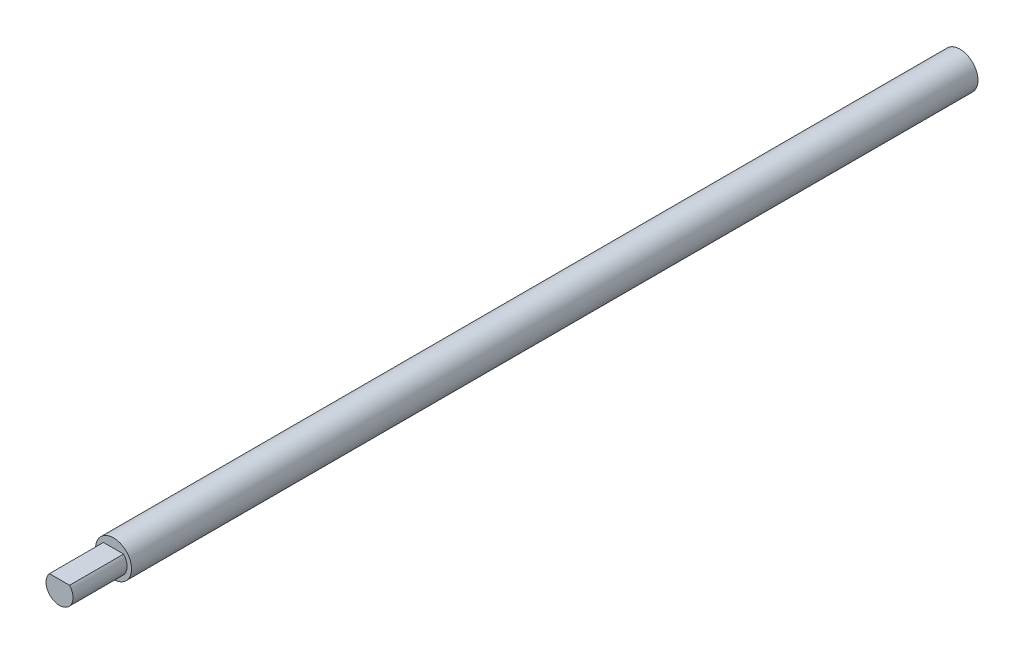
ISO-10303-21;
HEADER;
FILE_DESCRIPTION(('STEP AP214'),'2;1');
FILE_NAME('part.step','',(''),(''),'','','');
FILE_SCHEMA(('AUTOMOTIVE_DESIGN { 1 0 10303 214 1 1 1 1 }'));
ENDSEC;
DATA;
#1=APPLICATION_CONTEXT('core data for automotive mechanical design processes');
#2=APPLICATION_PROTOCOL_DEFINITION('international standard','automotive_design',2000,#1);
#3=PRODUCT_CONTEXT('',#1,'mechanical');
#4=PRODUCT('Part','Part','',(#3));
#5=PRODUCT_RELATED_PRODUCT_CATEGORY('part','',(#4));
#6=PRODUCT_DEFINITION_FORMATION('','',#4);
#7=PRODUCT_DEFINITION_CONTEXT('part definition',#1,'design');
#8=PRODUCT_DEFINITION('design','',#6,#7);
#9=PRODUCT_DEFINITION_SHAPE('','',#8);
#10=(LENGTH_UNIT() NAMED_UNIT(*) SI_UNIT(.MILLI.,.METRE.));
#11=(NAMED_UNIT(*) PLANE_ANGLE_UNIT() SI_UNIT($,.RADIAN.));
#12=(NAMED_UNIT(*) SI_UNIT($,.STERADIAN.) SOLID_ANGLE_UNIT());
#13=UNCERTAINTY_MEASURE_WITH_UNIT(LENGTH_MEASURE(1.E-05),#10,'distance_accuracy_value','');
#14=(GEOMETRIC_REPRESENTATION_CONTEXT(3) GLOBAL_UNCERTAINTY_ASSIGNED_CONTEXT((#13)) GLOBAL_UNIT_ASSIGNED_CONTEXT((#10,
#11,#12)) REPRESENTATION_CONTEXT('',''));
#15=CARTESIAN_POINT('',(0.,0.,0.));
#16=DIRECTION('',(0.,0.,1.));
#17=DIRECTION('',(1.,0.,0.));
#18=AXIS2_PLACEMENT_3D('',#15,#16,#17);
#19=CARTESIAN_POINT('',(0.,0.,0.));
#20=DIRECTION('',(0.,0.,1.));
#21=DIRECTION('',(1.,0.,0.));
#22=AXIS2_PLACEMENT_3D('',#19,#20,#21);
#23=PLANE('',#22);
#24=CARTESIAN_POINT('',(0.,0.,0.));
#25=DIRECTION('',(0.,0.,1.));
#26=DIRECTION('',(1.,0.,0.));
#27=AXIS2_PLACEMENT_3D('',#24,#25,#26);
#28=CIRCLE('',#27,4.);
#29=CARTESIAN_POINT('',(4.,0.,0.));
#30=VERTEX_POINT('',#29);
#31=EDGE_CURVE('E69',#30,#30,#28,.T.);
#32=ORIENTED_EDGE('',*,*,#31,.F.);
#33=EDGE_LOOP('',(#32));
#34=FACE_BOUND('',#33,.T.);
#35=ADVANCED_FACE('F34',(#34),#23,.F.);
#36=CARTESIAN_POINT('',(0.,0.,0.));
#37=DIRECTION('',(0.,0.,1.));
#38=DIRECTION('',(1.,0.,0.));
#39=AXIS2_PLACEMENT_3D('',#36,#37,#38);
#40=CYLINDRICAL_SURFACE('',#39,4.);
#41=CARTESIAN_POINT('',(0.,0.,188.));
#42=DIRECTION('',(0.,0.,-1.));
#43=DIRECTION('',(-1.,0.,0.));
#44=AXIS2_PLACEMENT_3D('',#41,#42,#43);
#45=CIRCLE('',#44,4.);
#46=CARTESIAN_POINT('',(-4.,0.,188.));
#47=VERTEX_POINT('',#46);
#48=EDGE_CURVE('E77',#47,#47,#45,.F.);
#49=ORIENTED_EDGE('',*,*,#48,.F.);
#50=EDGE_LOOP('',(#49));
#51=FACE_BOUND('',#50,.T.);
#52=ORIENTED_EDGE('',*,*,#31,.T.);
#53=EDGE_LOOP('',(#52));
#54=FACE_BOUND('',#53,.T.);
#55=ADVANCED_FACE('F81',(#51,#54),#40,.T.);
#56=CARTESIAN_POINT('',(0.,0.,200.));
#57=DIRECTION('',(0.,0.,1.));
#58=DIRECTION('',(1.,0.,0.));
#59=AXIS2_PLACEMENT_3D('',#56,#57,#58);
#60=PLANE('',#59);
#61=CARTESIAN_POINT('',(0.,0.,200.));
#62=DIRECTION('',(0.,0.,-1.));
#63=DIRECTION('',(-1.,0.,0.));
#64=AXIS2_PLACEMENT_3D('',#61,#62,#63);
#65=CIRCLE('',#64,2.99999999999997);
#66=CARTESIAN_POINT('',(2.23606797749975,2.,200.));
#67=VERTEX_POINT('',#66);
#68=CARTESIAN_POINT('',(-2.23606797749975,2.,200.));
#69=VERTEX_POINT('',#68);
#70=EDGE_CURVE('E57',#67,#69,#65,.T.);
#71=ORIENTED_EDGE('',*,*,#70,.F.);
#72=DIRECTION('',(1.,0.,0.));
#73=VECTOR('',#72,1.);
#74=CARTESIAN_POINT('',(0.,2.,200.));
#75=LINE('',#74,#73);
#76=EDGE_CURVE('E72',#69,#67,#75,.T.);
#77=ORIENTED_EDGE('',*,*,#76,.F.);
#78=EDGE_LOOP('',(#71,#77));
#79=FACE_BOUND('',#78,.T.);
#80=ADVANCED_FACE('F84',(#79),#60,.T.);
#81=CARTESIAN_POINT('',(-4.,2.,188.));
#82=DIRECTION('',(0.,0.,-1.));
#83=DIRECTION('',(-1.,0.,0.));
#84=AXIS2_PLACEMENT_3D('',#81,#82,#83);
#85=PLANE('',#84);
#86=DIRECTION('',(1.,0.,0.));
#87=VECTOR('',#86,1.);
#88=CARTESIAN_POINT('',(-4.,2.,188.));
#89=LINE('',#88,#87);
#90=CARTESIAN_POINT('',(-2.23606797749975,2.,188.));
#91=VERTEX_POINT('',#90);
#92=CARTESIAN_POINT('',(2.23606797749975,2.,188.));
#93=VERTEX_POINT('',#92);
#94=EDGE_CURVE('E66',#91,#93,#89,.T.);
#95=ORIENTED_EDGE('',*,*,#94,.T.);
#96=CARTESIAN_POINT('',(0.,0.,188.));
#97=DIRECTION('',(0.,0.,-1.));
#98=DIRECTION('',(-1.,0.,0.));
#99=AXIS2_PLACEMENT_3D('',#96,#97,#98);
#100=CIRCLE('',#99,2.99999999999997);
#101=EDGE_CURVE('E48',#93,#91,#100,.T.);
#102=ORIENTED_EDGE('',*,*,#101,.T.);
#103=EDGE_LOOP('',(#95,#102));
#104=FACE_BOUND('',#103,.T.);
#105=ORIENTED_EDGE('',*,*,#48,.T.);
#106=EDGE_LOOP('',(#105));
#107=FACE_BOUND('',#106,.T.);
#108=ADVANCED_FACE('F64',(#104,#107),#85,.F.);
#109=CARTESIAN_POINT('',(-4.,2.,200.));
#110=DIRECTION('',(0.,-1.,0.));
#111=DIRECTION('',(0.,0.,-1.));
#112=AXIS2_PLACEMENT_3D('',#109,#110,#111);
#113=PLANE('',#112);
#114=ORIENTED_EDGE('',*,*,#94,.F.);
#115=DIRECTION('',(0.,0.,-1.));
#116=VECTOR('',#115,1.);
#117=CARTESIAN_POINT('',(-2.23606797749975,2.,0.));
#118=LINE('',#117,#116);
#119=EDGE_CURVE('E11',#91,#69,#118,.F.);
#120=ORIENTED_EDGE('',*,*,#119,.T.);
#121=ORIENTED_EDGE('',*,*,#76,.T.);
#122=DIRECTION('',(0.,0.,-1.));
#123=VECTOR('',#122,1.);
#124=CARTESIAN_POINT('',(2.23606797749975,2.,0.));
#125=LINE('',#124,#123);
#126=EDGE_CURVE('E41',#67,#93,#125,.T.);
#127=ORIENTED_EDGE('',*,*,#126,.T.);
#128=EDGE_LOOP('',(#114,#120,#121,#127));
#129=FACE_BOUND('',#128,.T.);
#130=ADVANCED_FACE('F68',(#129),#113,.F.);
#131=CARTESIAN_POINT('',(0.,0.,0.));
#132=DIRECTION('',(0.,0.,-1.));
#133=DIRECTION('',(-1.,0.,0.));
#134=AXIS2_PLACEMENT_3D('',#131,#132,#133);
#135=CYLINDRICAL_SURFACE('',#134,2.99999999999997);
#136=ORIENTED_EDGE('',*,*,#101,.F.);
#137=ORIENTED_EDGE('',*,*,#126,.F.);
#138=ORIENTED_EDGE('',*,*,#70,.T.);
#139=ORIENTED_EDGE('',*,*,#119,.F.);
#140=EDGE_LOOP('',(#136,#137,#138,#139));
#141=FACE_BOUND('',#140,.T.);
#142=ADVANCED_FACE('F56',(#141),#135,.T.);
#143=CLOSED_SHELL('',(#35,#55,#80,#108,#130,#142));
#144=MANIFOLD_SOLID_BREP('B2',#143);
#145=ADVANCED_BREP_SHAPE_REPRESENTATION('',(#18,#144),#14);
#146=SHAPE_DEFINITION_REPRESENTATION(#9,#145);
ENDSEC;
END-ISO-10303-21;
